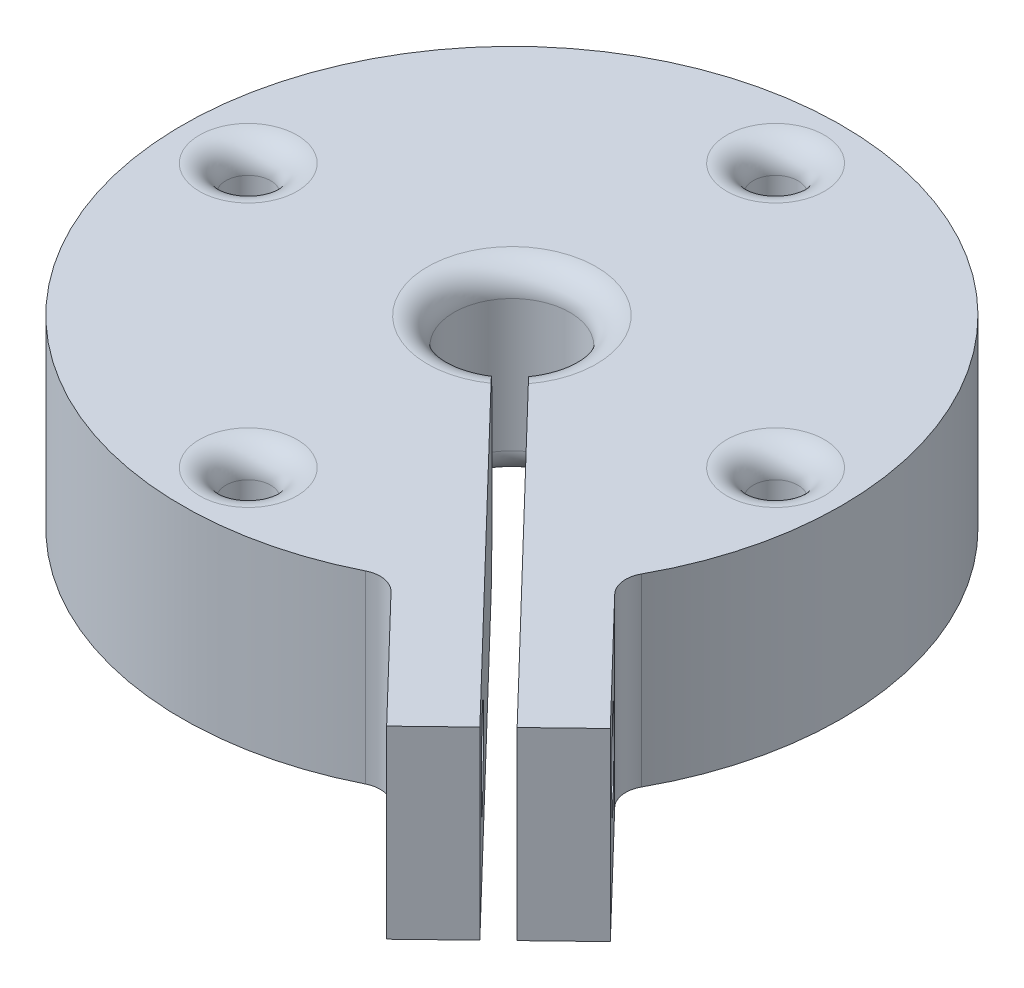
ISO-10303-21;
HEADER;
FILE_DESCRIPTION(('STEP AP214'),'2;1');
FILE_NAME('part.step','',(''),(''),'','','');
FILE_SCHEMA(('AUTOMOTIVE_DESIGN { 1 0 10303 214 1 1 1 1 }'));
ENDSEC;
DATA;
#1=APPLICATION_CONTEXT('core data for automotive mechanical design processes');
#2=APPLICATION_PROTOCOL_DEFINITION('international standard','automotive_design',2000,#1);
#3=PRODUCT_CONTEXT('',#1,'mechanical');
#4=PRODUCT('Part','Part','',(#3));
#5=PRODUCT_RELATED_PRODUCT_CATEGORY('part','',(#4));
#6=PRODUCT_DEFINITION_FORMATION('','',#4);
#7=PRODUCT_DEFINITION_CONTEXT('part definition',#1,'design');
#8=PRODUCT_DEFINITION('design','',#6,#7);
#9=PRODUCT_DEFINITION_SHAPE('','',#8);
#10=(LENGTH_UNIT() NAMED_UNIT(*) SI_UNIT(.MILLI.,.METRE.));
#11=(NAMED_UNIT(*) PLANE_ANGLE_UNIT() SI_UNIT($,.RADIAN.));
#12=(NAMED_UNIT(*) SI_UNIT($,.STERADIAN.) SOLID_ANGLE_UNIT());
#13=UNCERTAINTY_MEASURE_WITH_UNIT(LENGTH_MEASURE(1.E-05),#10,'distance_accuracy_value','');
#14=(GEOMETRIC_REPRESENTATION_CONTEXT(3) GLOBAL_UNCERTAINTY_ASSIGNED_CONTEXT((#13)) GLOBAL_UNIT_ASSIGNED_CONTEXT((#10,
#11,#12)) REPRESENTATION_CONTEXT('',''));
#15=CARTESIAN_POINT('',(0.,0.,0.));
#16=DIRECTION('',(0.,0.,1.));
#17=DIRECTION('',(1.,0.,0.));
#18=AXIS2_PLACEMENT_3D('',#15,#16,#17);
#19=CARTESIAN_POINT('',(13.2733886754542,-12.9977142702002,13.782322317501));
#20=DIRECTION('',(0.693682977003078,0.,0.720280450530311));
#21=DIRECTION('',(0.720280450530311,0.,-0.693682977003078));
#22=AXIS2_PLACEMENT_3D('',#19,#20,#21);
#23=PLANE('',#22);
#24=DIRECTION('',(0.,1.,0.));
#25=VECTOR('',#24,1.);
#26=CARTESIAN_POINT('',(12.9132484501891,0.,14.1291638060025));
#27=LINE('',#26,#25);
#28=CARTESIAN_POINT('',(12.9132484501891,0.,14.1291638060025));
#29=VERTEX_POINT('',#28);
#30=CARTESIAN_POINT('',(12.9132484501891,7.,14.1291638060025));
#31=VERTEX_POINT('',#30);
#32=EDGE_CURVE('E126',#29,#31,#27,.T.);
#33=ORIENTED_EDGE('',*,*,#32,.T.);
#34=DIRECTION('',(0.720280450530311,0.,-0.693682977003078));
#35=VECTOR('',#34,1.);
#36=CARTESIAN_POINT('',(13.2733886754542,7.,13.782322317501));
#37=LINE('',#36,#35);
#38=CARTESIAN_POINT('',(11.1125473238633,7.,15.8633712485102));
#39=VERTEX_POINT('',#38);
#40=EDGE_CURVE('E305',#39,#31,#37,.T.);
#41=ORIENTED_EDGE('',*,*,#40,.F.);
#42=DIRECTION('',(0.,1.,0.));
#43=VECTOR('',#42,1.);
#44=CARTESIAN_POINT('',(11.1125473238633,-12.9977142702002,15.8633712485102));
#45=LINE('',#44,#43);
#46=CARTESIAN_POINT('',(11.1125473238633,0.,15.8633712485102));
#47=VERTEX_POINT('',#46);
#48=EDGE_CURVE('E153',#47,#39,#45,.T.);
#49=ORIENTED_EDGE('',*,*,#48,.F.);
#50=DIRECTION('',(-0.720280450530311,0.,0.693682977003078));
#51=VECTOR('',#50,1.);
#52=CARTESIAN_POINT('',(13.2733886754542,0.,13.782322317501));
#53=LINE('',#52,#51);
#54=EDGE_CURVE('E144',#29,#47,#53,.T.);
#55=ORIENTED_EDGE('',*,*,#54,.F.);
#56=EDGE_LOOP('',(#33,#41,#49,#55));
#57=FACE_BOUND('',#56,.T.);
#58=ADVANCED_FACE('F38',(#57),#23,.T.);
#59=CARTESIAN_POINT('',(0.,7.,0.));
#60=DIRECTION('',(0.,1.,0.));
#61=DIRECTION('',(0.,0.,1.));
#62=AXIS2_PLACEMENT_3D('',#59,#60,#61);
#63=PLANE('',#62);
#64=DIRECTION('',(0.693682977003081,0.,0.720280450530308));
#65=VECTOR('',#64,1.);
#66=CARTESIAN_POINT('',(0.362654377642341,7.,1.09734977468192));
#67=LINE('',#66,#65);
#68=CARTESIAN_POINT('',(1.83238087272061,7.,2.62342911802237));
#69=VERTEX_POINT('',#68);
#70=EDGE_CURVE('E132',#69,#31,#67,.T.);
#71=ORIENTED_EDGE('',*,*,#70,.F.);
#72=CARTESIAN_POINT('',(0.,7.,0.));
#73=DIRECTION('',(0.,1.,0.));
#74=DIRECTION('',(0.,0.,1.));
#75=AXIS2_PLACEMENT_3D('',#72,#73,#74);
#76=CIRCLE('',#75,3.2);
#77=CARTESIAN_POINT('',(2.55266132325092,7.,1.92974614101929));
#78=VERTEX_POINT('',#77);
#79=EDGE_CURVE('E240',#69,#78,#76,.F.);
#80=ORIENTED_EDGE('',*,*,#79,.T.);
#81=DIRECTION('',(-0.693682977003081,0.,-0.720280450530308));
#82=VECTOR('',#81,1.);
#83=CARTESIAN_POINT('',(13.6335289007194,7.,13.4354808289994));
#84=LINE('',#83,#82);
#85=CARTESIAN_POINT('',(13.6335289007194,7.,13.4354808289994));
#86=VERTEX_POINT('',#85);
#87=EDGE_CURVE('E492',#86,#78,#84,.T.);
#88=ORIENTED_EDGE('',*,*,#87,.F.);
#89=CARTESIAN_POINT('',(15.4342300270452,7.,11.7012733864917));
#90=VERTEX_POINT('',#89);
#91=EDGE_CURVE('E307',#86,#90,#37,.T.);
#92=ORIENTED_EDGE('',*,*,#91,.T.);
#93=DIRECTION('',(-0.693682977003081,0.,-0.720280450530308));
#94=VECTOR('',#93,1.);
#95=CARTESIAN_POINT('',(15.4342300270452,7.,11.7012733864917));
#96=LINE('',#95,#94);
#97=CARTESIAN_POINT('',(11.1050488104475,7.,7.20610095110927));
#98=VERTEX_POINT('',#97);
#99=EDGE_CURVE('E296',#90,#98,#96,.T.);
#100=ORIENTED_EDGE('',*,*,#99,.T.);
#101=CARTESIAN_POINT('',(11.8253292609778,7.,6.51241797410619));
#102=DIRECTION('',(0.,1.,0.));
#103=DIRECTION('',(0.,0.,1.));
#104=AXIS2_PLACEMENT_3D('',#101,#102,#103);
#105=CIRCLE('',#104,1.);
#106=CARTESIAN_POINT('',(10.9493789453499,7.,6.03001664269092));
#107=VERTEX_POINT('',#106);
#108=EDGE_CURVE('E271',#98,#107,#105,.F.);
#109=ORIENTED_EDGE('',*,*,#108,.T.);
#110=CARTESIAN_POINT('',(0.,7.,0.));
#111=DIRECTION('',(0.,1.,0.));
#112=DIRECTION('',(0.,0.,1.));
#113=AXIS2_PLACEMENT_3D('',#110,#111,#112);
#114=CIRCLE('',#113,12.5);
#115=CARTESIAN_POINT('',(5.6139682006809,7.,11.168409064936));
#116=VERTEX_POINT('',#115);
#117=EDGE_CURVE('E168',#107,#116,#114,.T.);
#118=ORIENTED_EDGE('',*,*,#117,.T.);
#119=CARTESIAN_POINT('',(6.06308565673537,7.,12.0618817901308));
#120=DIRECTION('',(0.,1.,0.));
#121=DIRECTION('',(0.,0.,1.));
#122=AXIS2_PLACEMENT_3D('',#119,#120,#121);
#123=CIRCLE('',#122,1.);
#124=CARTESIAN_POINT('',(6.78336610726568,7.,11.3681988131278));
#125=VERTEX_POINT('',#124);
#126=EDGE_CURVE('E47',#116,#125,#123,.F.);
#127=ORIENTED_EDGE('',*,*,#126,.T.);
#128=DIRECTION('',(0.69368297700308,0.,0.720280450530308));
#129=VECTOR('',#128,1.);
#130=CARTESIAN_POINT('',(6.25676648484176,7.,10.8214080947981));
#131=LINE('',#130,#129);
#132=EDGE_CURVE('E303',#125,#39,#131,.T.);
#133=ORIENTED_EDGE('',*,*,#132,.T.);
#134=ORIENTED_EDGE('',*,*,#40,.T.);
#135=EDGE_LOOP('',(#71,#80,#88,#92,#100,#109,#118,#127,#133,#134));
#136=FACE_BOUND('',#135,.T.);
#137=CARTESIAN_POINT('',(10.,7.,0.));
#138=DIRECTION('',(0.,1.,0.));
#139=DIRECTION('',(0.,0.,1.));
#140=AXIS2_PLACEMENT_3D('',#137,#138,#139);
#141=CIRCLE('',#140,1.85);
#142=CARTESIAN_POINT('',(10.,7.,1.85));
#143=VERTEX_POINT('',#142);
#144=EDGE_CURVE('E248',#143,#143,#141,.F.);
#145=ORIENTED_EDGE('',*,*,#144,.T.);
#146=EDGE_LOOP('',(#145));
#147=FACE_BOUND('',#146,.T.);
#148=CARTESIAN_POINT('',(0.,7.,-10.));
#149=DIRECTION('',(0.,1.,0.));
#150=DIRECTION('',(0.,0.,1.));
#151=AXIS2_PLACEMENT_3D('',#148,#149,#150);
#152=CIRCLE('',#151,1.85);
#153=CARTESIAN_POINT('',(0.,7.,-8.15));
#154=VERTEX_POINT('',#153);
#155=EDGE_CURVE('E244',#154,#154,#152,.F.);
#156=ORIENTED_EDGE('',*,*,#155,.T.);
#157=EDGE_LOOP('',(#156));
#158=FACE_BOUND('',#157,.T.);
#159=CARTESIAN_POINT('',(0.,7.,10.));
#160=DIRECTION('',(0.,1.,0.));
#161=DIRECTION('',(0.,0.,1.));
#162=AXIS2_PLACEMENT_3D('',#159,#160,#161);
#163=CIRCLE('',#162,1.85);
#164=CARTESIAN_POINT('',(0.,7.,11.85));
#165=VERTEX_POINT('',#164);
#166=EDGE_CURVE('E236',#165,#165,#163,.F.);
#167=ORIENTED_EDGE('',*,*,#166,.T.);
#168=EDGE_LOOP('',(#167));
#169=FACE_BOUND('',#168,.T.);
#170=CARTESIAN_POINT('',(-10.,7.,0.));
#171=DIRECTION('',(0.,1.,0.));
#172=DIRECTION('',(0.,0.,1.));
#173=AXIS2_PLACEMENT_3D('',#170,#171,#172);
#174=CIRCLE('',#173,1.85);
#175=CARTESIAN_POINT('',(-10.,7.,1.85));
#176=VERTEX_POINT('',#175);
#177=EDGE_CURVE('E232',#176,#176,#174,.F.);
#178=ORIENTED_EDGE('',*,*,#177,.T.);
#179=EDGE_LOOP('',(#178));
#180=FACE_BOUND('',#179,.T.);
#181=ADVANCED_FACE('F294',(#136,#147,#158,#169,#180),#63,.T.);
#182=CARTESIAN_POINT('',(0.,0.,0.));
#183=DIRECTION('',(0.,1.,0.));
#184=DIRECTION('',(0.,0.,1.));
#185=AXIS2_PLACEMENT_3D('',#182,#183,#184);
#186=PLANE('',#185);
#187=CARTESIAN_POINT('',(10.,0.,0.));
#188=DIRECTION('',(0.,1.,0.));
#189=DIRECTION('',(0.,0.,1.));
#190=AXIS2_PLACEMENT_3D('',#187,#188,#189);
#191=CIRCLE('',#190,1.85);
#192=CARTESIAN_POINT('',(10.,0.,1.85));
#193=VERTEX_POINT('',#192);
#194=EDGE_CURVE('E188',#193,#193,#191,.T.);
#195=ORIENTED_EDGE('',*,*,#194,.T.);
#196=EDGE_LOOP('',(#195));
#197=FACE_BOUND('',#196,.T.);
#198=CARTESIAN_POINT('',(0.,0.,10.));
#199=DIRECTION('',(0.,1.,0.));
#200=DIRECTION('',(0.,0.,1.));
#201=AXIS2_PLACEMENT_3D('',#198,#199,#200);
#202=CIRCLE('',#201,1.85);
#203=CARTESIAN_POINT('',(0.,0.,11.85));
#204=VERTEX_POINT('',#203);
#205=EDGE_CURVE('E184',#204,#204,#202,.T.);
#206=ORIENTED_EDGE('',*,*,#205,.T.);
#207=EDGE_LOOP('',(#206));
#208=FACE_BOUND('',#207,.T.);
#209=CARTESIAN_POINT('',(0.,0.,-10.));
#210=DIRECTION('',(0.,1.,0.));
#211=DIRECTION('',(0.,0.,1.));
#212=AXIS2_PLACEMENT_3D('',#209,#210,#211);
#213=CIRCLE('',#212,1.85);
#214=CARTESIAN_POINT('',(0.,0.,-8.15));
#215=VERTEX_POINT('',#214);
#216=EDGE_CURVE('E180',#215,#215,#213,.T.);
#217=ORIENTED_EDGE('',*,*,#216,.T.);
#218=EDGE_LOOP('',(#217));
#219=FACE_BOUND('',#218,.T.);
#220=CARTESIAN_POINT('',(-10.,0.,0.));
#221=DIRECTION('',(0.,1.,0.));
#222=DIRECTION('',(0.,0.,1.));
#223=AXIS2_PLACEMENT_3D('',#220,#221,#222);
#224=CIRCLE('',#223,1.85);
#225=CARTESIAN_POINT('',(-10.,0.,1.85));
#226=VERTEX_POINT('',#225);
#227=EDGE_CURVE('E171',#226,#226,#224,.T.);
#228=ORIENTED_EDGE('',*,*,#227,.T.);
#229=EDGE_LOOP('',(#228));
#230=FACE_BOUND('',#229,.T.);
#231=CARTESIAN_POINT('',(0.,0.,0.));
#232=DIRECTION('',(0.,1.,0.));
#233=DIRECTION('',(0.,0.,1.));
#234=AXIS2_PLACEMENT_3D('',#231,#232,#233);
#235=CIRCLE('',#234,3.2);
#236=CARTESIAN_POINT('',(2.55266132325092,0.,1.92974614101929));
#237=VERTEX_POINT('',#236);
#238=CARTESIAN_POINT('',(1.83238087272061,0.,2.62342911802237));
#239=VERTEX_POINT('',#238);
#240=EDGE_CURVE('E147',#237,#239,#235,.T.);
#241=ORIENTED_EDGE('',*,*,#240,.T.);
#242=DIRECTION('',(0.693682977003081,0.,0.720280450530308));
#243=VECTOR('',#242,1.);
#244=CARTESIAN_POINT('',(0.362654377642341,0.,1.09734977468192));
#245=LINE('',#244,#243);
#246=EDGE_CURVE('E129',#239,#29,#245,.T.);
#247=ORIENTED_EDGE('',*,*,#246,.T.);
#248=ORIENTED_EDGE('',*,*,#54,.T.);
#249=DIRECTION('',(-0.69368297700308,0.,-0.720280450530308));
#250=VECTOR('',#249,1.);
#251=CARTESIAN_POINT('',(6.25676648484176,0.,10.8214080947981));
#252=LINE('',#251,#250);
#253=CARTESIAN_POINT('',(6.78336610726568,0.,11.3681988131278));
#254=VERTEX_POINT('',#253);
#255=EDGE_CURVE('E156',#47,#254,#252,.T.);
#256=ORIENTED_EDGE('',*,*,#255,.T.);
#257=CARTESIAN_POINT('',(6.06308565673537,0.,12.0618817901308));
#258=DIRECTION('',(0.,1.,0.));
#259=DIRECTION('',(0.,0.,1.));
#260=AXIS2_PLACEMENT_3D('',#257,#258,#259);
#261=CIRCLE('',#260,1.);
#262=CARTESIAN_POINT('',(5.6139682006809,0.,11.168409064936));
#263=VERTEX_POINT('',#262);
#264=EDGE_CURVE('E11',#254,#263,#261,.T.);
#265=ORIENTED_EDGE('',*,*,#264,.T.);
#266=CARTESIAN_POINT('',(0.,0.,0.));
#267=DIRECTION('',(0.,1.,0.));
#268=DIRECTION('',(0.,0.,1.));
#269=AXIS2_PLACEMENT_3D('',#266,#267,#268);
#270=CIRCLE('',#269,12.5);
#271=CARTESIAN_POINT('',(10.9493789453499,0.,6.03001664269092));
#272=VERTEX_POINT('',#271);
#273=EDGE_CURVE('E161',#272,#263,#270,.T.);
#274=ORIENTED_EDGE('',*,*,#273,.F.);
#275=CARTESIAN_POINT('',(11.8253292609778,0.,6.51241797410619));
#276=DIRECTION('',(0.,1.,0.));
#277=DIRECTION('',(0.,0.,1.));
#278=AXIS2_PLACEMENT_3D('',#275,#276,#277);
#279=CIRCLE('',#278,1.);
#280=CARTESIAN_POINT('',(11.1050488104475,0.,7.20610095110927));
#281=VERTEX_POINT('',#280);
#282=EDGE_CURVE('E274',#272,#281,#279,.T.);
#283=ORIENTED_EDGE('',*,*,#282,.T.);
#284=DIRECTION('',(0.693682977003081,0.,0.720280450530308));
#285=VECTOR('',#284,1.);
#286=CARTESIAN_POINT('',(15.4342300270452,0.,11.7012733864917));
#287=LINE('',#286,#285);
#288=CARTESIAN_POINT('',(15.4342300270452,0.,11.7012733864917));
#289=VERTEX_POINT('',#288);
#290=EDGE_CURVE('E162',#281,#289,#287,.T.);
#291=ORIENTED_EDGE('',*,*,#290,.T.);
#292=CARTESIAN_POINT('',(13.6335289007194,0.,13.4354808289994));
#293=VERTEX_POINT('',#292);
#294=EDGE_CURVE('E155',#289,#293,#53,.T.);
#295=ORIENTED_EDGE('',*,*,#294,.T.);
#296=DIRECTION('',(-0.693682977003081,0.,-0.720280450530308));
#297=VECTOR('',#296,1.);
#298=CARTESIAN_POINT('',(13.6335289007194,0.,13.4354808289994));
#299=LINE('',#298,#297);
#300=EDGE_CURVE('E149',#293,#237,#299,.T.);
#301=ORIENTED_EDGE('',*,*,#300,.T.);
#302=EDGE_LOOP('',(#241,#247,#248,#256,#265,#274,#283,#291,#295,#301));
#303=FACE_BOUND('',#302,.T.);
#304=ADVANCED_FACE('F143',(#197,#208,#219,#230,#303),#186,.F.);
#305=CARTESIAN_POINT('',(0.,7.,0.));
#306=DIRECTION('',(0.,-1.,0.));
#307=DIRECTION('',(0.,0.,-1.));
#308=AXIS2_PLACEMENT_3D('',#305,#306,#307);
#309=CYLINDRICAL_SURFACE('',#308,12.5);
#310=ORIENTED_EDGE('',*,*,#117,.F.);
#311=DIRECTION('',(0.,-1.,0.));
#312=VECTOR('',#311,1.);
#313=CARTESIAN_POINT('',(10.9493789453499,7.,6.03001664269092));
#314=LINE('',#313,#312);
#315=EDGE_CURVE('E266',#107,#272,#314,.T.);
#316=ORIENTED_EDGE('',*,*,#315,.T.);
#317=ORIENTED_EDGE('',*,*,#273,.T.);
#318=DIRECTION('',(0.,-1.,0.));
#319=VECTOR('',#318,1.);
#320=CARTESIAN_POINT('',(5.6139682006809,7.,11.168409064936));
#321=LINE('',#320,#319);
#322=EDGE_CURVE('E262',#263,#116,#321,.F.);
#323=ORIENTED_EDGE('',*,*,#322,.T.);
#324=EDGE_LOOP('',(#310,#316,#317,#323));
#325=FACE_BOUND('',#324,.T.);
#326=ADVANCED_FACE('F298',(#325),#309,.T.);
#327=CARTESIAN_POINT('',(0.,7.,0.));
#328=DIRECTION('',(0.,-1.,0.));
#329=DIRECTION('',(0.,0.,-1.));
#330=AXIS2_PLACEMENT_3D('',#327,#328,#329);
#331=CYLINDRICAL_SURFACE('',#330,2.2);
#332=DIRECTION('',(0.,-1.,0.));
#333=VECTOR('',#332,1.);
#334=CARTESIAN_POINT('',(1.12602597444466,7.,1.88999087428378));
#335=LINE('',#334,#333);
#336=CARTESIAN_POINT('',(1.12602597444466,1.,1.88999087428378));
#337=VERTEX_POINT('',#336);
#338=CARTESIAN_POINT('',(1.12602597444465,6.,1.88999087428378));
#339=VERTEX_POINT('',#338);
#340=EDGE_CURVE('E330',#337,#339,#335,.F.);
#341=ORIENTED_EDGE('',*,*,#340,.F.);
#342=CARTESIAN_POINT('',(0.,1.,0.));
#343=DIRECTION('',(0.,1.,0.));
#344=DIRECTION('',(0.,0.,1.));
#345=AXIS2_PLACEMENT_3D('',#342,#343,#344);
#346=CIRCLE('',#345,2.2);
#347=CARTESIAN_POINT('',(1.84630642497496,1.,1.1963078972807));
#348=VERTEX_POINT('',#347);
#349=EDGE_CURVE('E220',#337,#348,#346,.F.);
#350=ORIENTED_EDGE('',*,*,#349,.T.);
#351=DIRECTION('',(0.,-1.,0.));
#352=VECTOR('',#351,1.);
#353=CARTESIAN_POINT('',(1.84630642497496,7.,1.1963078972807));
#354=LINE('',#353,#352);
#355=CARTESIAN_POINT('',(1.84630642497496,6.,1.1963078972807));
#356=VERTEX_POINT('',#355);
#357=EDGE_CURVE('E386',#356,#348,#354,.T.);
#358=ORIENTED_EDGE('',*,*,#357,.F.);
#359=CARTESIAN_POINT('',(0.,6.,0.));
#360=DIRECTION('',(0.,1.,0.));
#361=DIRECTION('',(0.,0.,1.));
#362=AXIS2_PLACEMENT_3D('',#359,#360,#361);
#363=CIRCLE('',#362,2.2);
#364=EDGE_CURVE('E216',#356,#339,#363,.T.);
#365=ORIENTED_EDGE('',*,*,#364,.T.);
#366=EDGE_LOOP('',(#341,#350,#358,#365));
#367=FACE_BOUND('',#366,.T.);
#368=ADVANCED_FACE('F422',(#367),#331,.F.);
#369=CARTESIAN_POINT('',(0.,7.,-10.));
#370=DIRECTION('',(0.,-1.,0.));
#371=DIRECTION('',(0.,0.,-1.));
#372=AXIS2_PLACEMENT_3D('',#369,#370,#371);
#373=CYLINDRICAL_SURFACE('',#372,0.85);
#374=CARTESIAN_POINT('',(0.,1.,-10.));
#375=DIRECTION('',(0.,1.,0.));
#376=DIRECTION('',(0.,0.,1.));
#377=AXIS2_PLACEMENT_3D('',#374,#375,#376);
#378=CIRCLE('',#377,0.85);
#379=CARTESIAN_POINT('',(0.,1.,-9.15));
#380=VERTEX_POINT('',#379);
#381=EDGE_CURVE('E212',#380,#380,#378,.F.);
#382=ORIENTED_EDGE('',*,*,#381,.T.);
#383=EDGE_LOOP('',(#382));
#384=FACE_BOUND('',#383,.T.);
#385=CARTESIAN_POINT('',(0.,6.,-10.));
#386=DIRECTION('',(0.,1.,0.));
#387=DIRECTION('',(0.,0.,1.));
#388=AXIS2_PLACEMENT_3D('',#385,#386,#387);
#389=CIRCLE('',#388,0.85);
#390=CARTESIAN_POINT('',(0.,6.,-9.15));
#391=VERTEX_POINT('',#390);
#392=EDGE_CURVE('E208',#391,#391,#389,.T.);
#393=ORIENTED_EDGE('',*,*,#392,.T.);
#394=EDGE_LOOP('',(#393));
#395=FACE_BOUND('',#394,.T.);
#396=ADVANCED_FACE('F418',(#384,#395),#373,.F.);
#397=CARTESIAN_POINT('',(10.,7.,0.));
#398=DIRECTION('',(0.,-1.,0.));
#399=DIRECTION('',(0.,0.,-1.));
#400=AXIS2_PLACEMENT_3D('',#397,#398,#399);
#401=CYLINDRICAL_SURFACE('',#400,0.85);
#402=CARTESIAN_POINT('',(10.,1.,0.));
#403=DIRECTION('',(0.,1.,0.));
#404=DIRECTION('',(0.,0.,1.));
#405=AXIS2_PLACEMENT_3D('',#402,#403,#404);
#406=CIRCLE('',#405,0.85);
#407=CARTESIAN_POINT('',(10.,1.,0.849999999999999));
#408=VERTEX_POINT('',#407);
#409=EDGE_CURVE('E196',#408,#408,#406,.F.);
#410=ORIENTED_EDGE('',*,*,#409,.T.);
#411=EDGE_LOOP('',(#410));
#412=FACE_BOUND('',#411,.T.);
#413=CARTESIAN_POINT('',(10.,6.,0.));
#414=DIRECTION('',(0.,1.,0.));
#415=DIRECTION('',(0.,0.,1.));
#416=AXIS2_PLACEMENT_3D('',#413,#414,#415);
#417=CIRCLE('',#416,0.85);
#418=CARTESIAN_POINT('',(10.,6.,0.849999999999999));
#419=VERTEX_POINT('',#418);
#420=EDGE_CURVE('E192',#419,#419,#417,.T.);
#421=ORIENTED_EDGE('',*,*,#420,.T.);
#422=EDGE_LOOP('',(#421));
#423=FACE_BOUND('',#422,.T.);
#424=ADVANCED_FACE('F414',(#412,#423),#401,.F.);
#425=CARTESIAN_POINT('',(0.,7.,10.));
#426=DIRECTION('',(0.,-1.,0.));
#427=DIRECTION('',(0.,0.,-1.));
#428=AXIS2_PLACEMENT_3D('',#425,#426,#427);
#429=CYLINDRICAL_SURFACE('',#428,0.85);
#430=CARTESIAN_POINT('',(0.,1.,10.));
#431=DIRECTION('',(0.,1.,0.));
#432=DIRECTION('',(0.,0.,1.));
#433=AXIS2_PLACEMENT_3D('',#430,#431,#432);
#434=CIRCLE('',#433,0.85);
#435=CARTESIAN_POINT('',(0.,1.,10.85));
#436=VERTEX_POINT('',#435);
#437=EDGE_CURVE('E204',#436,#436,#434,.F.);
#438=ORIENTED_EDGE('',*,*,#437,.T.);
#439=EDGE_LOOP('',(#438));
#440=FACE_BOUND('',#439,.T.);
#441=CARTESIAN_POINT('',(0.,6.,10.));
#442=DIRECTION('',(0.,1.,0.));
#443=DIRECTION('',(0.,0.,1.));
#444=AXIS2_PLACEMENT_3D('',#441,#442,#443);
#445=CIRCLE('',#444,0.85);
#446=CARTESIAN_POINT('',(0.,6.,10.85));
#447=VERTEX_POINT('',#446);
#448=EDGE_CURVE('E200',#447,#447,#445,.T.);
#449=ORIENTED_EDGE('',*,*,#448,.T.);
#450=EDGE_LOOP('',(#449));
#451=FACE_BOUND('',#450,.T.);
#452=ADVANCED_FACE('F410',(#440,#451),#429,.F.);
#453=CARTESIAN_POINT('',(-10.,7.,0.));
#454=DIRECTION('',(0.,-1.,0.));
#455=DIRECTION('',(0.,0.,-1.));
#456=AXIS2_PLACEMENT_3D('',#453,#454,#455);
#457=CYLINDRICAL_SURFACE('',#456,0.85);
#458=CARTESIAN_POINT('',(-10.,1.,0.));
#459=DIRECTION('',(0.,1.,0.));
#460=DIRECTION('',(0.,0.,1.));
#461=AXIS2_PLACEMENT_3D('',#458,#459,#460);
#462=CIRCLE('',#461,0.85);
#463=CARTESIAN_POINT('',(-10.,1.,0.850000000000002));
#464=VERTEX_POINT('',#463);
#465=EDGE_CURVE('E228',#464,#464,#462,.F.);
#466=ORIENTED_EDGE('',*,*,#465,.T.);
#467=EDGE_LOOP('',(#466));
#468=FACE_BOUND('',#467,.T.);
#469=CARTESIAN_POINT('',(-10.,6.,0.));
#470=DIRECTION('',(0.,1.,0.));
#471=DIRECTION('',(0.,0.,1.));
#472=AXIS2_PLACEMENT_3D('',#469,#470,#471);
#473=CIRCLE('',#472,0.85);
#474=CARTESIAN_POINT('',(-10.,6.,0.850000000000002));
#475=VERTEX_POINT('',#474);
#476=EDGE_CURVE('E224',#475,#475,#473,.T.);
#477=ORIENTED_EDGE('',*,*,#476,.T.);
#478=EDGE_LOOP('',(#477));
#479=FACE_BOUND('',#478,.T.);
#480=ADVANCED_FACE('F406',(#468,#479),#457,.F.);
#481=CARTESIAN_POINT('',(10.,1.,0.));
#482=DIRECTION('',(0.,1.,0.));
#483=DIRECTION('',(0.,0.,1.));
#484=AXIS2_PLACEMENT_3D('',#481,#482,#483);
#485=TOROIDAL_SURFACE('',#484,1.85,1.);
#486=ORIENTED_EDGE('',*,*,#409,.F.);
#487=EDGE_LOOP('',(#486));
#488=FACE_BOUND('',#487,.T.);
#489=ORIENTED_EDGE('',*,*,#194,.F.);
#490=EDGE_LOOP('',(#489));
#491=FACE_BOUND('',#490,.T.);
#492=ADVANCED_FACE('F409',(#488,#491),#485,.T.);
#493=CARTESIAN_POINT('',(0.,1.,10.));
#494=DIRECTION('',(0.,1.,0.));
#495=DIRECTION('',(0.,0.,1.));
#496=AXIS2_PLACEMENT_3D('',#493,#494,#495);
#497=TOROIDAL_SURFACE('',#496,1.85,1.);
#498=ORIENTED_EDGE('',*,*,#437,.F.);
#499=EDGE_LOOP('',(#498));
#500=FACE_BOUND('',#499,.T.);
#501=ORIENTED_EDGE('',*,*,#205,.F.);
#502=EDGE_LOOP('',(#501));
#503=FACE_BOUND('',#502,.T.);
#504=ADVANCED_FACE('F434',(#500,#503),#497,.T.);
#505=CARTESIAN_POINT('',(0.,1.,-10.));
#506=DIRECTION('',(0.,1.,0.));
#507=DIRECTION('',(0.,0.,1.));
#508=AXIS2_PLACEMENT_3D('',#505,#506,#507);
#509=TOROIDAL_SURFACE('',#508,1.85,1.);
#510=ORIENTED_EDGE('',*,*,#381,.F.);
#511=EDGE_LOOP('',(#510));
#512=FACE_BOUND('',#511,.T.);
#513=ORIENTED_EDGE('',*,*,#216,.F.);
#514=EDGE_LOOP('',(#513));
#515=FACE_BOUND('',#514,.T.);
#516=ADVANCED_FACE('F437',(#512,#515),#509,.T.);
#517=CARTESIAN_POINT('',(0.,1.,0.));
#518=DIRECTION('',(0.,1.,0.));
#519=DIRECTION('',(0.,0.,1.));
#520=AXIS2_PLACEMENT_3D('',#517,#518,#519);
#521=TOROIDAL_SURFACE('',#520,3.2,1.);
#522=CARTESIAN_POINT('',(2.38785359471981,0.39062775974147,3.20019999999992));
#523=CARTESIAN_POINT('',(2.37582511212215,0.368243554087665,3.18771031645302));
#524=CARTESIAN_POINT('',(2.36314261099348,0.346607328150292,3.17454153773183));
#525=CARTESIAN_POINT('',(2.33655467941783,0.304960853286308,3.14693416092014));
#526=CARTESIAN_POINT('',(2.32264936085554,0.284950455922174,3.13249567900427));
#527=CARTESIAN_POINT('',(2.27928034367254,0.22762241401462,3.08746378940739));
#528=CARTESIAN_POINT('',(2.2481155403474,0.192918766448631,3.05510405257675));
#529=CARTESIAN_POINT('',(2.18220318398546,0.131538142157616,2.98666445796394));
#530=CARTESIAN_POINT('',(2.14745471458254,0.104863225296607,2.95058364867999));
#531=CARTESIAN_POINT('',(2.07536010068973,0.0602338947219556,2.87572475391531));
#532=CARTESIAN_POINT('',(2.03801414948504,0.0422788329337743,2.83694686913081));
#533=CARTESIAN_POINT('',(1.96151385478684,0.0154554289045438,2.75751336916376));
#534=CARTESIAN_POINT('',(1.92234885409542,0.0066503321533446,2.7168466881607));
#535=CARTESIAN_POINT('',(1.84354315173585,-0.00145696462383466,2.63501938565842));
#536=CARTESIAN_POINT('',(1.80390236370947,-0.000757412619774519,2.5938586744898));
#537=CARTESIAN_POINT('',(1.72486457628463,0.010146125495662,2.51179038822272));
#538=CARTESIAN_POINT('',(1.68547371621697,0.0204426576874169,2.47088918785179));
#539=CARTESIAN_POINT('',(1.60843621853479,0.0503621610912891,2.39089788724647));
#540=CARTESIAN_POINT('',(1.57078957390428,0.0699850947849453,2.35180777972708));
#541=CARTESIAN_POINT('',(1.49807367217743,0.118158304118337,2.27630377545872));
#542=CARTESIAN_POINT('',(1.46302145184694,0.146762059854544,2.23990756870616));
#543=CARTESIAN_POINT('',(1.39676048341509,0.212077238850832,2.17110599539833));
#544=CARTESIAN_POINT('',(1.36555169177321,0.248788570250585,2.1387005836331));
#545=CARTESIAN_POINT('',(1.30802816888599,0.329153360251565,2.07897147054415));
#546=CARTESIAN_POINT('',(1.28169378166311,0.372777559450185,2.05162735958545));
#547=CARTESIAN_POINT('',(1.23457926458279,0.465893964437177,2.0027063586179));
#548=CARTESIAN_POINT('',(1.21380021802475,0.515387312005625,1.98113059344478));
#549=CARTESIAN_POINT('',(1.17880363284881,0.617919051793175,1.94479215503239));
#550=CARTESIAN_POINT('',(1.1644797873806,0.670882189243189,1.92991909888254));
#551=CARTESIAN_POINT('',(1.14239074664822,0.779530886176262,1.90698311120811));
#552=CARTESIAN_POINT('',(1.13461454363267,0.835211709298607,1.8989087498685));
#553=CARTESIAN_POINT('',(1.12883319314164,0.909447193222705,1.89290572849648));
#554=CARTESIAN_POINT('',(1.12777782410694,0.927579893941525,1.89180989407501));
#555=CARTESIAN_POINT('',(1.12637388708085,0.963872480534421,1.89035212672711));
#556=CARTESIAN_POINT('',(1.12602417108097,0.982032274076074,1.88998900177479));
#557=CARTESIAN_POINT('',(1.12602598869113,1.0002,1.8899908890765));
#558=B_SPLINE_CURVE_WITH_KNOTS('',3,(#522,#523,#524,#525,#526,#527,#528,#529,#530,#531,#532,
#533,#534,#535,#536,#537,#538,#539,#540,#541,#542,#543,#544,#545,#546,#547,#548,#549,#550,#551,
#552,#553,#554,#555,#556,#557),.UNSPECIFIED.,.F.,.F.,(4,2,2,2,2,2,2,2,2,2,2,2,2,2,2,2,2,4),(0.,
0.0848914502938094,0.169775141301181,0.339208185200451,0.508684662131313,0.678148541352306,
0.84877613454089,1.01943518062498,1.19175715171819,1.3640784295965,1.53744597797333,
1.71081156216464,1.88346205013237,2.05614618067803,2.22587206798311,2.3953120429174,
2.44988092272793,2.50436095404283),.UNSPECIFIED.);
#559=EDGE_CURVE('E312',#239,#337,#558,.T.);
#560=ORIENTED_EDGE('',*,*,#559,.F.);
#561=ORIENTED_EDGE('',*,*,#240,.F.);
#562=CARTESIAN_POINT('',(1.84630643922144,1.0002,1.19630791207342));
#563=CARTESIAN_POINT('',(1.8463022257705,0.97253369597907,1.19630353706865));
#564=CARTESIAN_POINT('',(1.84711694200937,0.944880676263206,1.19714949148737));
#565=CARTESIAN_POINT('',(1.8503724034934,0.88977761057882,1.20052977519352));
#566=CARTESIAN_POINT('',(1.85281295165013,0.862327540415876,1.20306389983568));
#567=CARTESIAN_POINT('',(1.86253986227116,0.780670857053364,1.21316376360147));
#568=CARTESIAN_POINT('',(1.87223160560533,0.727019451214799,1.22322711168206));
#569=CARTESIAN_POINT('',(1.89770334710868,0.622839966315832,1.24967550100984));
#570=CARTESIAN_POINT('',(1.91348399800447,0.572312222783817,1.26606122001074));
#571=CARTESIAN_POINT('',(1.95062595540876,0.475710010499343,1.30462728938196));
#572=CARTESIAN_POINT('',(1.971987763162,0.429635942241724,1.32680816021595));
#573=CARTESIAN_POINT('',(2.01998020628556,0.34254214469983,1.37664074902249));
#574=CARTESIAN_POINT('',(2.04668023186117,0.301601953511837,1.40436451778766));
#575=CARTESIAN_POINT('',(2.10438072609853,0.226587216584058,1.4642773877339));
#576=CARTESIAN_POINT('',(2.13538209389223,0.192514109968498,1.49646742252181));
#577=CARTESIAN_POINT('',(2.20153897586071,0.131449504641603,1.56516091844094));
#578=CARTESIAN_POINT('',(2.23677037740626,0.104628761577976,1.60174317664725));
#579=CARTESIAN_POINT('',(2.30983183876971,0.059792408663305,1.67760599013969));
#580=CARTESIAN_POINT('',(2.34766193115309,0.0417769091781753,1.71688657923996));
#581=CARTESIAN_POINT('',(2.42527880235866,0.0149106967048284,1.79747946794284));
#582=CARTESIAN_POINT('',(2.46508192581539,0.00615795567166094,1.83880873887261));
#583=CARTESIAN_POINT('',(2.54514464241256,-0.00157155504636528,1.92194125256126));
#584=CARTESIAN_POINT('',(2.58540425070494,-0.000547999275490652,1.96374451105304));
#585=CARTESIAN_POINT('',(2.66515002720191,0.0112758371592393,2.04654793239586));
#586=CARTESIAN_POINT('',(2.70463753181487,0.0220573456394905,2.08754948289637));
#587=CARTESIAN_POINT('',(2.78177159279204,0.053108088221666,2.16764104926563));
#588=CARTESIAN_POINT('',(2.81941840306996,0.0733760096234724,2.20673132878375));
#589=CARTESIAN_POINT('',(2.89144720785604,0.12263632984509,2.28152189116228));
#590=CARTESIAN_POINT('',(2.9258552368774,0.15154961661749,2.31724920676175));
#591=CARTESIAN_POINT('',(2.99078789714091,0.217389564517066,2.38467154137171));
#592=CARTESIAN_POINT('',(3.02131080773022,0.254319756741307,2.4163647737554));
#593=CARTESIAN_POINT('',(3.07728637726507,0.334761233031389,2.47448658123789));
#594=CARTESIAN_POINT('',(3.10278269466875,0.378209495823274,2.5009604887651));
#595=CARTESIAN_POINT('',(3.14825405037897,0.470640917414794,2.54817532560409));
#596=CARTESIAN_POINT('',(3.16824124129439,0.519611552345455,2.56892887348498));
#597=CARTESIAN_POINT('',(3.19049470263008,0.586562615052902,2.59203558604405));
#598=CARTESIAN_POINT('',(3.19550083114986,0.602716670776361,2.59723366157016));
#599=CARTESIAN_POINT('',(3.2002,0.619044984221658,2.60211300785471));
#600=B_SPLINE_CURVE_WITH_KNOTS('',3,(#562,#563,#564,#565,#566,#567,#568,#569,#570,#571,#572,
#573,#574,#575,#576,#577,#578,#579,#580,#581,#582,#583,#584,#585,#586,#587,#588,#589,#590,#591,
#592,#593,#594,#595,#596,#597,#598,#599),.UNSPECIFIED.,.F.,.F.,(4,2,2,2,2,2,2,2,2,2,2,2,2,2,2,2,
2,2,4),(0.,0.0829470386050233,0.165884023939855,0.331348404106652,0.496830526868811,
0.662327516723354,0.8301348585481,0.997977331011706,1.1694823678369,1.34098955427042,
1.51429317162108,1.68760255831913,1.86057924240686,2.03353199759599,2.20494816178417,
2.37643998106097,2.54636944808825,2.7159210110411,2.76897186097173),.UNSPECIFIED.);
#601=EDGE_CURVE('E327',#348,#237,#600,.T.);
#602=ORIENTED_EDGE('',*,*,#601,.F.);
#603=ORIENTED_EDGE('',*,*,#349,.F.);
#604=EDGE_LOOP('',(#560,#561,#602,#603));
#605=FACE_BOUND('',#604,.T.);
#606=ADVANCED_FACE('F325',(#605),#521,.T.);
#607=CARTESIAN_POINT('',(-10.,1.,0.));
#608=DIRECTION('',(0.,1.,0.));
#609=DIRECTION('',(0.,0.,1.));
#610=AXIS2_PLACEMENT_3D('',#607,#608,#609);
#611=TOROIDAL_SURFACE('',#610,1.85,1.);
#612=ORIENTED_EDGE('',*,*,#465,.F.);
#613=EDGE_LOOP('',(#612));
#614=FACE_BOUND('',#613,.T.);
#615=ORIENTED_EDGE('',*,*,#227,.F.);
#616=EDGE_LOOP('',(#615));
#617=FACE_BOUND('',#616,.T.);
#618=ADVANCED_FACE('F445',(#614,#617),#611,.T.);
#619=CARTESIAN_POINT('',(10.,6.,0.));
#620=DIRECTION('',(0.,1.,0.));
#621=DIRECTION('',(0.,0.,1.));
#622=AXIS2_PLACEMENT_3D('',#619,#620,#621);
#623=TOROIDAL_SURFACE('',#622,1.85,1.);
#624=ORIENTED_EDGE('',*,*,#144,.F.);
#625=EDGE_LOOP('',(#624));
#626=FACE_BOUND('',#625,.T.);
#627=ORIENTED_EDGE('',*,*,#420,.F.);
#628=EDGE_LOOP('',(#627));
#629=FACE_BOUND('',#628,.T.);
#630=ADVANCED_FACE('F454',(#626,#629),#623,.T.);
#631=CARTESIAN_POINT('',(0.,6.,-10.));
#632=DIRECTION('',(0.,1.,0.));
#633=DIRECTION('',(0.,0.,1.));
#634=AXIS2_PLACEMENT_3D('',#631,#632,#633);
#635=TOROIDAL_SURFACE('',#634,1.85,1.);
#636=ORIENTED_EDGE('',*,*,#155,.F.);
#637=EDGE_LOOP('',(#636));
#638=FACE_BOUND('',#637,.T.);
#639=ORIENTED_EDGE('',*,*,#392,.F.);
#640=EDGE_LOOP('',(#639));
#641=FACE_BOUND('',#640,.T.);
#642=ADVANCED_FACE('F374',(#638,#641),#635,.T.);
#643=CARTESIAN_POINT('',(0.,6.,0.));
#644=DIRECTION('',(0.,1.,0.));
#645=DIRECTION('',(0.,0.,1.));
#646=AXIS2_PLACEMENT_3D('',#643,#644,#645);
#647=TOROIDAL_SURFACE('',#646,3.2,1.);
#648=CARTESIAN_POINT('',(1.12602598869113,5.9998,1.8899908890765));
#649=CARTESIAN_POINT('',(1.12602177526843,6.02746625820951,1.88998651410104));
#650=CARTESIAN_POINT('',(1.12683648878681,6.05511923209806,1.89083246569496));
#651=CARTESIAN_POINT('',(1.13009193948033,6.11022220730433,1.89421273819687));
#652=CARTESIAN_POINT('',(1.13253247957833,6.13767223281506,1.89674685447131));
#653=CARTESIAN_POINT('',(1.14225937966435,6.21932896502611,1.90684670729816));
#654=CARTESIAN_POINT('',(1.15195113398287,6.27298046246006,1.91691006678426));
#655=CARTESIAN_POINT('',(1.17742291233974,6.37716009820639,1.94335849437861));
#656=CARTESIAN_POINT('',(1.19320358655762,6.42768790229969,1.95974423759583));
#657=CARTESIAN_POINT('',(1.23034555774742,6.52429010358468,1.99831032128113));
#658=CARTESIAN_POINT('',(1.25170734219906,6.57036411127959,2.02049116792008));
#659=CARTESIAN_POINT('',(1.29969970556331,6.6574577643525,2.07032367390915));
#660=CARTESIAN_POINT('',(1.3263996702599,6.69839787669817,2.09804737946106));
#661=CARTESIAN_POINT('',(1.38410014695927,6.7734126416137,2.15796023119686));
#662=CARTESIAN_POINT('',(1.41510157587561,6.8074858265999,2.19015032945099));
#663=CARTESIAN_POINT('',(1.48125854919748,6.86855051855314,2.25884392022622));
#664=CARTESIAN_POINT('',(1.51648997641044,6.89537128011321,2.29542620508408));
#665=CARTESIAN_POINT('',(1.58955144443056,6.94020761452645,2.37128902548843));
#666=CARTESIAN_POINT('',(1.62738151405651,6.95822308971153,2.41056959095868));
#667=CARTESIAN_POINT('',(1.7049992805641,6.98508963758284,2.49116340929164));
#668=CARTESIAN_POINT('',(1.74480336096258,6.99384250443396,2.53249367385459));
#669=CARTESIAN_POINT('',(1.82486615521216,7.00157146652666,2.61562626817303));
#670=CARTESIAN_POINT('',(1.86512486241104,7.00054770463789,2.65742859102123));
#671=CARTESIAN_POINT('',(1.94486230639666,6.98872537765419,2.74022336036417));
#672=CARTESIAN_POINT('',(1.98434248846996,6.97794710266522,2.78121730756124));
#673=CARTESIAN_POINT('',(2.0614778877356,6.94689867267377,2.86131026353217));
#674=CARTESIAN_POINT('',(2.09913269895362,6.92662641673932,2.90040885076568));
#675=CARTESIAN_POINT('',(2.17119886977121,6.87734286558836,2.97523821187923));
#676=CARTESIAN_POINT('',(2.2056341381911,6.84840405668175,3.01099381130127));
#677=CARTESIAN_POINT('',(2.27056931173725,6.78253384451889,3.07841875555917));
#678=CARTESIAN_POINT('',(2.30107472777534,6.74561383254224,3.11009382260846));
#679=CARTESIAN_POINT('',(2.33963884065602,6.69019768079315,3.15013657631708));
#680=CARTESIAN_POINT('',(2.3497914144544,6.67464231652572,3.1606784242101));
#681=CARTESIAN_POINT('',(2.36936934172476,6.6426558217362,3.18100701629357));
#682=CARTESIAN_POINT('',(2.37879592310267,6.62622625311455,3.19079503547082));
#683=CARTESIAN_POINT('',(2.38785359471579,6.60937224026603,3.20019999999574));
#684=B_SPLINE_CURVE_WITH_KNOTS('',3,(#648,#649,#650,#651,#652,#653,#654,#655,#656,#657,#658,
#659,#660,#661,#662,#663,#664,#665,#666,#667,#668,#669,#670,#671,#672,#673,#674,#675,#676,#677,
#678,#679,#680,#681,#682,#683),.UNSPECIFIED.,.F.,.F.,(4,2,2,2,2,2,2,2,2,2,2,2,2,2,2,2,2,4),(0.,
0.0829469012630731,0.165883749814734,0.331348403373972,0.496830730267254,0.662327515979481,
0.830134510442337,0.997977330280733,1.16948249076502,1.34098955353859,1.51429732190169,
1.68760255765537,1.86054813220891,2.03353199614825,2.20510763222181,2.37643998269459,
2.44048098835173,2.50441118452436),.UNSPECIFIED.);
#685=EDGE_CURVE('E333',#339,#69,#684,.T.);
#686=ORIENTED_EDGE('',*,*,#685,.F.);
#687=ORIENTED_EDGE('',*,*,#364,.F.);
#688=CARTESIAN_POINT('',(3.2002,6.38095501577834,2.60211300785471));
#689=CARTESIAN_POINT('',(3.19271673631795,6.40694393075074,2.59434281784712));
#690=CARTESIAN_POINT('',(3.18447229301172,6.43246251325207,2.58578226275805));
#691=CARTESIAN_POINT('',(3.16651792752831,6.48240224871854,2.56713948372483));
#692=CARTESIAN_POINT('',(3.15680812208091,6.50682348889632,2.55705738098615));
#693=CARTESIAN_POINT('',(3.12560372657356,6.57812141543132,2.52465653391382));
#694=CARTESIAN_POINT('',(3.10200517130111,6.62313262063918,2.50015315328173));
#695=CARTESIAN_POINT('',(3.0499135260993,6.70680479734503,2.44606418913139));
#696=CARTESIAN_POINT('',(3.0214189058398,6.74546377595697,2.41647701660645));
#697=CARTESIAN_POINT('',(2.96035412973005,6.81538289257164,2.35307087013031));
#698=CARTESIAN_POINT('',(2.92778438899159,6.84664378324343,2.31925232720728));
#699=CARTESIAN_POINT('',(2.85931006218739,6.90107523176194,2.24815253004436));
#700=CARTESIAN_POINT('',(2.82338827279026,6.92420078057466,2.21085341285598));
#701=CARTESIAN_POINT('',(2.7493736026679,6.96152595341568,2.13400084228851));
#702=CARTESIAN_POINT('',(2.71128033577197,6.97572398435905,2.09444698793199));
#703=CARTESIAN_POINT('',(2.63361939328015,6.99493193720108,2.01380833814375));
#704=CARTESIAN_POINT('',(2.59404108934951,6.99985253953201,1.97271250686136));
#705=CARTESIAN_POINT('',(2.51487008209704,7.00014093329987,1.8905058927981));
#706=CARTESIAN_POINT('',(2.47527737879246,6.99550873614688,1.84939511003514));
#707=CARTESIAN_POINT('',(2.39680225448163,6.97676280838808,1.76791106073898));
#708=CARTESIAN_POINT('',(2.35793006868274,6.96255997269278,1.7275484218556));
#709=CARTESIAN_POINT('',(2.28237493731349,6.92499218280745,1.64909632505249));
#710=CARTESIAN_POINT('',(2.24569217220699,6.90162647456242,1.61100705451603));
#711=CARTESIAN_POINT('',(2.17539485138889,6.84624825313053,1.53801436536472));
#712=CARTESIAN_POINT('',(2.1417950138565,6.81419688467266,1.50312622925948));
#713=CARTESIAN_POINT('',(2.07883766803069,6.74236989105163,1.43775494739306));
#714=CARTESIAN_POINT('',(2.04947968233731,6.70259513630117,1.40727130592726));
#715=CARTESIAN_POINT('',(1.99608398542111,6.6167090651887,1.35182828958377));
#716=CARTESIAN_POINT('',(1.972010589096,6.57064388768668,1.32683186135116));
#717=CARTESIAN_POINT('',(1.9296858884049,6.47321588694987,1.28288432985189));
#718=CARTESIAN_POINT('',(1.91143696337965,6.42185091001597,1.26393569715563));
#719=CARTESIAN_POINT('',(1.88168949449854,6.31636350340943,1.23304763878004));
#720=CARTESIAN_POINT('',(1.87006828316338,6.26231278591005,1.22098084225527));
#721=CARTESIAN_POINT('',(1.85347393127819,6.15222486509468,1.20375022301222));
#722=CARTESIAN_POINT('',(1.84848433342117,6.09619293491921,1.19856931197423));
#723=CARTESIAN_POINT('',(1.84649390622922,6.02662841131752,1.19650256701711));
#724=CARTESIAN_POINT('',(1.8463031290683,6.01321133903093,1.19630447500105));
#725=CARTESIAN_POINT('',(1.84630643922144,5.9998,1.19630791207342));
#726=B_SPLINE_CURVE_WITH_KNOTS('',3,(#688,#689,#690,#691,#692,#693,#694,#695,#696,#697,#698,
#699,#700,#701,#702,#703,#704,#705,#706,#707,#708,#709,#710,#711,#712,#713,#714,#715,#716,#717,
#718,#719,#720,#721,#722,#723,#724,#725),.UNSPECIFIED.,.F.,.F.,(4,2,2,2,2,2,2,2,2,2,2,2,2,2,2,2,
2,2,4),(0.,0.0843643272912667,0.168721937720112,0.337115328672983,0.505561449281895,
0.673990425090418,0.843337102955293,1.01271399158391,1.18371341123832,1.35471262664728,
1.52732629682431,1.69995417515763,1.87336742922601,2.0467611512414,2.21894529413526,
2.39119968579764,2.56015284471236,2.72868593417586,2.76893285465122),.UNSPECIFIED.);
#727=EDGE_CURVE('E138',#78,#356,#726,.T.);
#728=ORIENTED_EDGE('',*,*,#727,.F.);
#729=ORIENTED_EDGE('',*,*,#79,.F.);
#730=EDGE_LOOP('',(#686,#687,#728,#729));
#731=FACE_BOUND('',#730,.T.);
#732=ADVANCED_FACE('F368',(#731),#647,.T.);
#733=CARTESIAN_POINT('',(0.,6.,10.));
#734=DIRECTION('',(0.,1.,0.));
#735=DIRECTION('',(0.,0.,1.));
#736=AXIS2_PLACEMENT_3D('',#733,#734,#735);
#737=TOROIDAL_SURFACE('',#736,1.85,1.);
#738=ORIENTED_EDGE('',*,*,#166,.F.);
#739=EDGE_LOOP('',(#738));
#740=FACE_BOUND('',#739,.T.);
#741=ORIENTED_EDGE('',*,*,#448,.F.);
#742=EDGE_LOOP('',(#741));
#743=FACE_BOUND('',#742,.T.);
#744=ADVANCED_FACE('F373',(#740,#743),#737,.T.);
#745=CARTESIAN_POINT('',(-10.,6.,0.));
#746=DIRECTION('',(0.,1.,0.));
#747=DIRECTION('',(0.,0.,1.));
#748=AXIS2_PLACEMENT_3D('',#745,#746,#747);
#749=TOROIDAL_SURFACE('',#748,1.85,1.);
#750=ORIENTED_EDGE('',*,*,#177,.F.);
#751=EDGE_LOOP('',(#750));
#752=FACE_BOUND('',#751,.T.);
#753=ORIENTED_EDGE('',*,*,#476,.F.);
#754=EDGE_LOOP('',(#753));
#755=FACE_BOUND('',#754,.T.);
#756=ADVANCED_FACE('F464',(#752,#755),#749,.T.);
#757=CARTESIAN_POINT('',(6.25676648484176,-12.9977142702002,10.8214080947981));
#758=DIRECTION('',(-0.720280450530308,0.,0.69368297700308));
#759=DIRECTION('',(0.69368297700308,0.,0.720280450530308));
#760=AXIS2_PLACEMENT_3D('',#757,#758,#759);
#761=PLANE('',#760);
#762=CARTESIAN_POINT('',(8.6140883086597,3.4618900881469,13.269115306297));
#763=DIRECTION('',(-0.720280450530308,0.,0.69368297700308));
#764=DIRECTION('',(0.69368297700308,0.,0.720280450530308));
#765=AXIS2_PLACEMENT_3D('',#762,#763,#764);
#766=CIRCLE('',#765,1.6);
#767=CARTESIAN_POINT('',(9.72398107186463,3.4618900881469,14.4215640271455));
#768=VERTEX_POINT('',#767);
#769=EDGE_CURVE('E488',#768,#768,#766,.T.);
#770=ORIENTED_EDGE('',*,*,#769,.F.);
#771=EDGE_LOOP('',(#770));
#772=FACE_BOUND('',#771,.T.);
#773=ORIENTED_EDGE('',*,*,#132,.F.);
#774=DIRECTION('',(0.,-1.,0.));
#775=VECTOR('',#774,1.);
#776=CARTESIAN_POINT('',(6.78336610726568,-12.9977142702002,11.3681988131278));
#777=LINE('',#776,#775);
#778=EDGE_CURVE('E60',#125,#254,#777,.T.);
#779=ORIENTED_EDGE('',*,*,#778,.T.);
#780=ORIENTED_EDGE('',*,*,#255,.F.);
#781=ORIENTED_EDGE('',*,*,#48,.T.);
#782=EDGE_LOOP('',(#773,#779,#780,#781));
#783=FACE_BOUND('',#782,.T.);
#784=ADVANCED_FACE('F302',(#772,#783),#761,.T.);
#785=CARTESIAN_POINT('',(15.4342300270452,-12.9977142702002,11.7012733864917));
#786=DIRECTION('',(0.720280450530308,0.,-0.693682977003081));
#787=DIRECTION('',(-0.693682977003081,0.,-0.720280450530308));
#788=AXIS2_PLACEMENT_3D('',#785,#786,#787);
#789=PLANE('',#788);
#790=CARTESIAN_POINT('',(12.9357710118416,3.4618900881469,9.10701744427852));
#791=DIRECTION('',(0.720280450530307,0.,-0.693682977003082));
#792=DIRECTION('',(-0.693682977003082,0.,-0.720280450530307));
#793=AXIS2_PLACEMENT_3D('',#790,#791,#792);
#794=CIRCLE('',#793,1.6);
#795=CARTESIAN_POINT('',(11.8258782486366,3.4618900881469,7.95456872343003));
#796=VERTEX_POINT('',#795);
#797=EDGE_CURVE('E258',#796,#796,#794,.T.);
#798=ORIENTED_EDGE('',*,*,#797,.F.);
#799=EDGE_LOOP('',(#798));
#800=FACE_BOUND('',#799,.T.);
#801=ORIENTED_EDGE('',*,*,#290,.F.);
#802=DIRECTION('',(0.,-1.,0.));
#803=VECTOR('',#802,1.);
#804=CARTESIAN_POINT('',(11.1050488104475,-12.9977142702002,7.20610095110927));
#805=LINE('',#804,#803);
#806=EDGE_CURVE('E252',#281,#98,#805,.F.);
#807=ORIENTED_EDGE('',*,*,#806,.T.);
#808=ORIENTED_EDGE('',*,*,#99,.F.);
#809=DIRECTION('',(0.,1.,0.));
#810=VECTOR('',#809,1.);
#811=CARTESIAN_POINT('',(15.4342300270452,-12.9977142702002,11.7012733864917));
#812=LINE('',#811,#810);
#813=EDGE_CURVE('E166',#289,#90,#812,.T.);
#814=ORIENTED_EDGE('',*,*,#813,.F.);
#815=EDGE_LOOP('',(#801,#807,#808,#814));
#816=FACE_BOUND('',#815,.T.);
#817=ADVANCED_FACE('F285',(#800,#816),#789,.T.);
#818=DIRECTION('',(0.,1.,0.));
#819=VECTOR('',#818,1.);
#820=CARTESIAN_POINT('',(13.6335289007194,0.,13.4354808289994));
#821=LINE('',#820,#819);
#822=EDGE_CURVE('E139',#293,#86,#821,.T.);
#823=ORIENTED_EDGE('',*,*,#822,.F.);
#824=ORIENTED_EDGE('',*,*,#294,.F.);
#825=ORIENTED_EDGE('',*,*,#813,.T.);
#826=ORIENTED_EDGE('',*,*,#91,.F.);
#827=EDGE_LOOP('',(#823,#824,#825,#826));
#828=FACE_BOUND('',#827,.T.);
#829=ADVANCED_FACE('F319',(#828),#23,.T.);
#830=CARTESIAN_POINT('',(13.6335289007194,0.,13.4354808289994));
#831=DIRECTION('',(0.720280450530308,0.,-0.693682977003081));
#832=DIRECTION('',(-0.693682977003081,0.,-0.720280450530308));
#833=AXIS2_PLACEMENT_3D('',#830,#831,#832);
#834=PLANE('',#833);
#835=CARTESIAN_POINT('',(11.1350698855158,3.4618900881469,10.8412248867862));
#836=DIRECTION('',(0.720280450530308,0.,-0.693682977003081));
#837=DIRECTION('',(-0.693682977003081,0.,-0.720280450530308));
#838=AXIS2_PLACEMENT_3D('',#835,#836,#837);
#839=CIRCLE('',#838,1.6);
#840=CARTESIAN_POINT('',(10.0251771223108,3.4618900881469,9.68877616593775));
#841=VERTEX_POINT('',#840);
#842=EDGE_CURVE('E257',#841,#841,#839,.T.);
#843=ORIENTED_EDGE('',*,*,#842,.T.);
#844=EDGE_LOOP('',(#843));
#845=FACE_BOUND('',#844,.T.);
#846=ORIENTED_EDGE('',*,*,#601,.T.);
#847=ORIENTED_EDGE('',*,*,#300,.F.);
#848=ORIENTED_EDGE('',*,*,#822,.T.);
#849=ORIENTED_EDGE('',*,*,#87,.T.);
#850=ORIENTED_EDGE('',*,*,#727,.T.);
#851=ORIENTED_EDGE('',*,*,#357,.T.);
#852=EDGE_LOOP('',(#846,#847,#848,#849,#850,#851));
#853=FACE_BOUND('',#852,.T.);
#854=ADVANCED_FACE('F350',(#845,#853),#834,.F.);
#855=CARTESIAN_POINT('',(0.362654377642341,0.,1.09734977468192));
#856=DIRECTION('',(-0.720280450530308,0.,0.693682977003081));
#857=DIRECTION('',(0.693682977003081,0.,0.720280450530308));
#858=AXIS2_PLACEMENT_3D('',#855,#856,#857);
#859=PLANE('',#858);
#860=CARTESIAN_POINT('',(10.4147894349855,3.4618900881469,11.5349078637893));
#861=DIRECTION('',(-0.720280450530308,0.,0.693682977003081));
#862=DIRECTION('',(0.693682977003081,0.,0.720280450530308));
#863=AXIS2_PLACEMENT_3D('',#860,#861,#862);
#864=CIRCLE('',#863,1.6);
#865=CARTESIAN_POINT('',(11.5246821981904,3.4618900881469,12.6873565846378));
#866=VERTEX_POINT('',#865);
#867=EDGE_CURVE('E253',#866,#866,#864,.T.);
#868=ORIENTED_EDGE('',*,*,#867,.T.);
#869=EDGE_LOOP('',(#868));
#870=FACE_BOUND('',#869,.T.);
#871=ORIENTED_EDGE('',*,*,#559,.T.);
#872=ORIENTED_EDGE('',*,*,#340,.T.);
#873=ORIENTED_EDGE('',*,*,#685,.T.);
#874=ORIENTED_EDGE('',*,*,#70,.T.);
#875=ORIENTED_EDGE('',*,*,#32,.F.);
#876=ORIENTED_EDGE('',*,*,#246,.F.);
#877=EDGE_LOOP('',(#871,#872,#873,#874,#875,#876));
#878=FACE_BOUND('',#877,.T.);
#879=ADVANCED_FACE('F128',(#870,#878),#859,.F.);
#880=CARTESIAN_POINT('',(-3.63619397926011,3.4618900881469,25.0670369080229));
#881=DIRECTION('',(0.720280450530307,0.,-0.693682977003082));
#882=DIRECTION('',(-0.693682977003082,0.,-0.720280450530307));
#883=AXIS2_PLACEMENT_3D('',#880,#881,#882);
#884=CYLINDRICAL_SURFACE('',#883,1.6);
#885=ORIENTED_EDGE('',*,*,#769,.T.);
#886=EDGE_LOOP('',(#885));
#887=FACE_BOUND('',#886,.T.);
#888=ORIENTED_EDGE('',*,*,#867,.F.);
#889=EDGE_LOOP('',(#888));
#890=FACE_BOUND('',#889,.T.);
#891=ADVANCED_FACE('F349',(#887,#890),#884,.F.);
#892=ORIENTED_EDGE('',*,*,#797,.T.);
#893=EDGE_LOOP('',(#892));
#894=FACE_BOUND('',#893,.T.);
#895=ORIENTED_EDGE('',*,*,#842,.F.);
#896=EDGE_LOOP('',(#895));
#897=FACE_BOUND('',#896,.T.);
#898=ADVANCED_FACE('F352',(#894,#897),#884,.F.);
#899=CARTESIAN_POINT('',(11.8253292609778,7.,6.51241797410619));
#900=DIRECTION('',(0.,-1.,0.));
#901=DIRECTION('',(0.,0.,-1.));
#902=AXIS2_PLACEMENT_3D('',#899,#900,#901);
#903=CYLINDRICAL_SURFACE('',#902,1.);
#904=ORIENTED_EDGE('',*,*,#282,.F.);
#905=ORIENTED_EDGE('',*,*,#315,.F.);
#906=ORIENTED_EDGE('',*,*,#108,.F.);
#907=ORIENTED_EDGE('',*,*,#806,.F.);
#908=EDGE_LOOP('',(#904,#905,#906,#907));
#909=FACE_BOUND('',#908,.T.);
#910=ADVANCED_FACE('F292',(#909),#903,.F.);
#911=CARTESIAN_POINT('',(6.06308565673537,7.,12.0618817901308));
#912=DIRECTION('',(0.,-1.,0.));
#913=DIRECTION('',(0.,0.,-1.));
#914=AXIS2_PLACEMENT_3D('',#911,#912,#913);
#915=CYLINDRICAL_SURFACE('',#914,1.);
#916=ORIENTED_EDGE('',*,*,#264,.F.);
#917=ORIENTED_EDGE('',*,*,#778,.F.);
#918=ORIENTED_EDGE('',*,*,#126,.F.);
#919=ORIENTED_EDGE('',*,*,#322,.F.);
#920=EDGE_LOOP('',(#916,#917,#918,#919));
#921=FACE_BOUND('',#920,.T.);
#922=ADVANCED_FACE('F40',(#921),#915,.F.);
#923=CLOSED_SHELL('',(#58,#181,#304,#326,#368,#396,#424,#452,#480,#492,#504,#516,#606,#618,#630,
#642,#732,#744,#756,#784,#817,#829,#854,#879,#891,#898,#910,#922));
#924=MANIFOLD_SOLID_BREP('B2',#923);
#925=ADVANCED_BREP_SHAPE_REPRESENTATION('',(#18,#924),#14);
#926=SHAPE_DEFINITION_REPRESENTATION(#9,#925);
ENDSEC;
END-ISO-10303-21;
